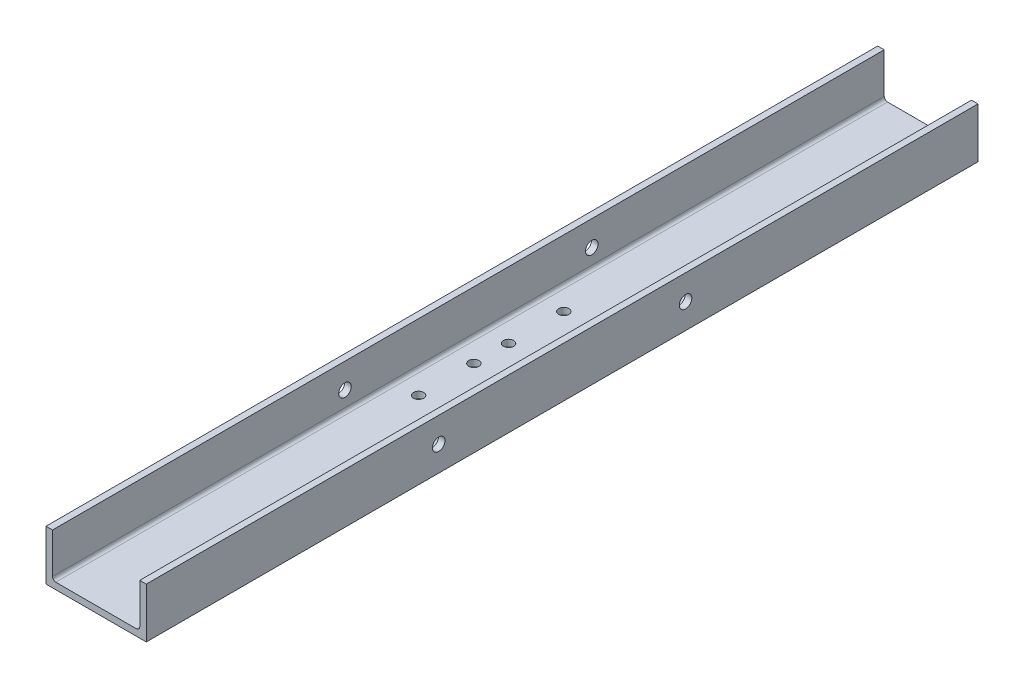
ISO-10303-21;
HEADER;
FILE_DESCRIPTION(('STEP AP214'),'2;1');
FILE_NAME('part.step','',(''),(''),'','','');
FILE_SCHEMA(('AUTOMOTIVE_DESIGN { 1 0 10303 214 1 1 1 1 }'));
ENDSEC;
DATA;
#1=APPLICATION_CONTEXT('core data for automotive mechanical design processes');
#2=APPLICATION_PROTOCOL_DEFINITION('international standard','automotive_design',2000,#1);
#3=PRODUCT_CONTEXT('',#1,'mechanical');
#4=PRODUCT('Part','Part','',(#3));
#5=PRODUCT_RELATED_PRODUCT_CATEGORY('part','',(#4));
#6=PRODUCT_DEFINITION_FORMATION('','',#4);
#7=PRODUCT_DEFINITION_CONTEXT('part definition',#1,'design');
#8=PRODUCT_DEFINITION('design','',#6,#7);
#9=PRODUCT_DEFINITION_SHAPE('','',#8);
#10=(LENGTH_UNIT() NAMED_UNIT(*) SI_UNIT(.MILLI.,.METRE.));
#11=(NAMED_UNIT(*) PLANE_ANGLE_UNIT() SI_UNIT($,.RADIAN.));
#12=(NAMED_UNIT(*) SI_UNIT($,.STERADIAN.) SOLID_ANGLE_UNIT());
#13=UNCERTAINTY_MEASURE_WITH_UNIT(LENGTH_MEASURE(1.E-05),#10,'distance_accuracy_value','');
#14=(GEOMETRIC_REPRESENTATION_CONTEXT(3) GLOBAL_UNCERTAINTY_ASSIGNED_CONTEXT((#13)) GLOBAL_UNIT_ASSIGNED_CONTEXT((#10,
#11,#12)) REPRESENTATION_CONTEXT('',''));
#15=CARTESIAN_POINT('',(0.,0.,0.));
#16=DIRECTION('',(0.,0.,1.));
#17=DIRECTION('',(1.,0.,0.));
#18=AXIS2_PLACEMENT_3D('',#15,#16,#17);
#19=CARTESIAN_POINT('',(-22.098,12.7,210.695));
#20=DIRECTION('',(0.,-1.,0.));
#21=DIRECTION('',(1.,0.,0.));
#22=AXIS2_PLACEMENT_3D('',#19,#20,#21);
#23=PLANE('',#22);
#24=DIRECTION('',(-1.,0.,0.));
#25=VECTOR('',#24,1.);
#26=CARTESIAN_POINT('',(-22.098,12.7,-210.695));
#27=LINE('',#26,#25);
#28=CARTESIAN_POINT('',(-22.098,12.7,-210.695));
#29=VERTEX_POINT('',#28);
#30=CARTESIAN_POINT('',(-25.4,12.7,-210.695));
#31=VERTEX_POINT('',#30);
#32=EDGE_CURVE('E138',#29,#31,#27,.T.);
#33=ORIENTED_EDGE('',*,*,#32,.T.);
#34=DIRECTION('',(0.,0.,-1.));
#35=VECTOR('',#34,1.);
#36=CARTESIAN_POINT('',(-25.4,12.7,210.695));
#37=LINE('',#36,#35);
#38=CARTESIAN_POINT('',(-25.4,12.7,210.695));
#39=VERTEX_POINT('',#38);
#40=EDGE_CURVE('E121',#39,#31,#37,.T.);
#41=ORIENTED_EDGE('',*,*,#40,.F.);
#42=DIRECTION('',(-1.,0.,0.));
#43=VECTOR('',#42,1.);
#44=CARTESIAN_POINT('',(-22.098,12.7,210.695));
#45=LINE('',#44,#43);
#46=CARTESIAN_POINT('',(-22.098,12.7,210.695));
#47=VERTEX_POINT('',#46);
#48=EDGE_CURVE('E127',#47,#39,#45,.T.);
#49=ORIENTED_EDGE('',*,*,#48,.F.);
#50=DIRECTION('',(0.,0.,-1.));
#51=VECTOR('',#50,1.);
#52=CARTESIAN_POINT('',(-22.098,12.7,210.695));
#53=LINE('',#52,#51);
#54=EDGE_CURVE('E241',#47,#29,#53,.T.);
#55=ORIENTED_EDGE('',*,*,#54,.T.);
#56=EDGE_LOOP('',(#33,#41,#49,#55));
#57=FACE_BOUND('',#56,.T.);
#58=ADVANCED_FACE('F39',(#57),#23,.F.);
#59=CARTESIAN_POINT('',(-25.4,12.7,210.695));
#60=DIRECTION('',(1.,0.,0.));
#61=DIRECTION('',(0.,1.,0.));
#62=AXIS2_PLACEMENT_3D('',#59,#60,#61);
#63=PLANE('',#62);
#64=CARTESIAN_POINT('',(-25.4,0.,62.52));
#65=DIRECTION('',(1.,0.,0.));
#66=DIRECTION('',(0.,1.,0.));
#67=AXIS2_PLACEMENT_3D('',#64,#65,#66);
#68=CIRCLE('',#67,3.18);
#69=CARTESIAN_POINT('',(-25.4,3.18,62.52));
#70=VERTEX_POINT('',#69);
#71=EDGE_CURVE('E179',#70,#70,#68,.T.);
#72=ORIENTED_EDGE('',*,*,#71,.T.);
#73=EDGE_LOOP('',(#72));
#74=FACE_BOUND('',#73,.T.);
#75=CARTESIAN_POINT('',(-25.4,0.,-62.52));
#76=DIRECTION('',(1.,0.,0.));
#77=DIRECTION('',(0.,1.,0.));
#78=AXIS2_PLACEMENT_3D('',#75,#76,#77);
#79=CIRCLE('',#78,3.18);
#80=CARTESIAN_POINT('',(-25.4,3.18000000000001,-62.52));
#81=VERTEX_POINT('',#80);
#82=EDGE_CURVE('E168',#81,#81,#79,.T.);
#83=ORIENTED_EDGE('',*,*,#82,.T.);
#84=EDGE_LOOP('',(#83));
#85=FACE_BOUND('',#84,.T.);
#86=DIRECTION('',(0.,-1.,0.));
#87=VECTOR('',#86,1.);
#88=CARTESIAN_POINT('',(-25.4,12.7,-210.695));
#89=LINE('',#88,#87);
#90=CARTESIAN_POINT('',(-25.4,-12.7,-210.695));
#91=VERTEX_POINT('',#90);
#92=EDGE_CURVE('E243',#31,#91,#89,.T.);
#93=ORIENTED_EDGE('',*,*,#92,.T.);
#94=DIRECTION('',(0.,0.,-1.));
#95=VECTOR('',#94,1.);
#96=CARTESIAN_POINT('',(-25.4,-12.7,210.695));
#97=LINE('',#96,#95);
#98=CARTESIAN_POINT('',(-25.4,-12.7,210.695));
#99=VERTEX_POINT('',#98);
#100=EDGE_CURVE('E124',#99,#91,#97,.T.);
#101=ORIENTED_EDGE('',*,*,#100,.F.);
#102=DIRECTION('',(0.,-1.,0.));
#103=VECTOR('',#102,1.);
#104=CARTESIAN_POINT('',(-25.4,12.7,210.695));
#105=LINE('',#104,#103);
#106=EDGE_CURVE('E117',#39,#99,#105,.T.);
#107=ORIENTED_EDGE('',*,*,#106,.F.);
#108=ORIENTED_EDGE('',*,*,#40,.T.);
#109=EDGE_LOOP('',(#93,#101,#107,#108));
#110=FACE_BOUND('',#109,.T.);
#111=ADVANCED_FACE('F119',(#74,#85,#110),#63,.F.);
#112=CARTESIAN_POINT('',(-25.4,-12.7,210.695));
#113=DIRECTION('',(0.,1.,0.));
#114=DIRECTION('',(-1.,0.,0.));
#115=AXIS2_PLACEMENT_3D('',#112,#113,#114);
#116=PLANE('',#115);
#117=CARTESIAN_POINT('',(-10.5304351416879,-12.7,36.79));
#118=DIRECTION('',(0.,1.,0.));
#119=DIRECTION('',(-1.,0.,0.));
#120=AXIS2_PLACEMENT_3D('',#117,#118,#119);
#121=CIRCLE('',#120,2.58499999999999);
#122=CARTESIAN_POINT('',(-13.1154351416879,-12.7,36.79));
#123=VERTEX_POINT('',#122);
#124=EDGE_CURVE('E227',#123,#123,#121,.T.);
#125=ORIENTED_EDGE('',*,*,#124,.T.);
#126=EDGE_LOOP('',(#125));
#127=FACE_BOUND('',#126,.T.);
#128=CARTESIAN_POINT('',(10.4695648583121,-12.7,-36.79));
#129=DIRECTION('',(0.,1.,0.));
#130=DIRECTION('',(-1.,0.,0.));
#131=AXIS2_PLACEMENT_3D('',#128,#129,#130);
#132=CIRCLE('',#131,2.58499999999999);
#133=CARTESIAN_POINT('',(7.88456485831209,-12.7,-36.79));
#134=VERTEX_POINT('',#133);
#135=EDGE_CURVE('E224',#134,#134,#132,.T.);
#136=ORIENTED_EDGE('',*,*,#135,.T.);
#137=EDGE_LOOP('',(#136));
#138=FACE_BOUND('',#137,.T.);
#139=CARTESIAN_POINT('',(-10.5304351416879,-12.7,-36.79));
#140=DIRECTION('',(0.,1.,0.));
#141=DIRECTION('',(-1.,0.,0.));
#142=AXIS2_PLACEMENT_3D('',#139,#140,#141);
#143=CIRCLE('',#142,2.58499999999999);
#144=CARTESIAN_POINT('',(-13.1154351416879,-12.7,-36.79));
#145=VERTEX_POINT('',#144);
#146=EDGE_CURVE('E221',#145,#145,#143,.T.);
#147=ORIENTED_EDGE('',*,*,#146,.T.);
#148=EDGE_LOOP('',(#147));
#149=FACE_BOUND('',#148,.T.);
#150=CARTESIAN_POINT('',(10.4695648583121,-12.7,-8.78999999999999));
#151=DIRECTION('',(0.,1.,0.));
#152=DIRECTION('',(-1.,0.,0.));
#153=AXIS2_PLACEMENT_3D('',#150,#151,#152);
#154=CIRCLE('',#153,2.58499999999999);
#155=CARTESIAN_POINT('',(7.88456485831208,-12.7,-8.78999999999999));
#156=VERTEX_POINT('',#155);
#157=EDGE_CURVE('E218',#156,#156,#154,.T.);
#158=ORIENTED_EDGE('',*,*,#157,.T.);
#159=EDGE_LOOP('',(#158));
#160=FACE_BOUND('',#159,.T.);
#161=CARTESIAN_POINT('',(10.4695648583121,-12.7,36.79));
#162=DIRECTION('',(0.,1.,0.));
#163=DIRECTION('',(-1.,0.,0.));
#164=AXIS2_PLACEMENT_3D('',#161,#162,#163);
#165=CIRCLE('',#164,2.58499999999999);
#166=CARTESIAN_POINT('',(7.88456485831209,-12.7,36.79));
#167=VERTEX_POINT('',#166);
#168=EDGE_CURVE('E215',#167,#167,#165,.T.);
#169=ORIENTED_EDGE('',*,*,#168,.T.);
#170=EDGE_LOOP('',(#169));
#171=FACE_BOUND('',#170,.T.);
#172=CARTESIAN_POINT('',(10.4695648583121,-12.7,8.78999999999999));
#173=DIRECTION('',(0.,1.,0.));
#174=DIRECTION('',(-1.,0.,0.));
#175=AXIS2_PLACEMENT_3D('',#172,#173,#174);
#176=CIRCLE('',#175,2.58499999999999);
#177=CARTESIAN_POINT('',(7.88456485831208,-12.7,8.78999999999999));
#178=VERTEX_POINT('',#177);
#179=EDGE_CURVE('E212',#178,#178,#176,.T.);
#180=ORIENTED_EDGE('',*,*,#179,.T.);
#181=EDGE_LOOP('',(#180));
#182=FACE_BOUND('',#181,.T.);
#183=CARTESIAN_POINT('',(-10.5304351416879,-12.7,8.79));
#184=DIRECTION('',(0.,1.,0.));
#185=DIRECTION('',(-1.,0.,0.));
#186=AXIS2_PLACEMENT_3D('',#183,#184,#185);
#187=CIRCLE('',#186,2.58499999999998);
#188=CARTESIAN_POINT('',(-13.1154351416879,-12.7,8.79));
#189=VERTEX_POINT('',#188);
#190=EDGE_CURVE('E209',#189,#189,#187,.T.);
#191=ORIENTED_EDGE('',*,*,#190,.T.);
#192=EDGE_LOOP('',(#191));
#193=FACE_BOUND('',#192,.T.);
#194=CARTESIAN_POINT('',(-10.5304351416879,-12.7,-8.79));
#195=DIRECTION('',(0.,1.,0.));
#196=DIRECTION('',(-1.,0.,0.));
#197=AXIS2_PLACEMENT_3D('',#194,#195,#196);
#198=CIRCLE('',#197,2.58499999999998);
#199=CARTESIAN_POINT('',(-13.1154351416879,-12.7,-8.79));
#200=VERTEX_POINT('',#199);
#201=EDGE_CURVE('E206',#200,#200,#198,.T.);
#202=ORIENTED_EDGE('',*,*,#201,.T.);
#203=EDGE_LOOP('',(#202));
#204=FACE_BOUND('',#203,.T.);
#205=DIRECTION('',(1.,0.,0.));
#206=VECTOR('',#205,1.);
#207=CARTESIAN_POINT('',(-25.4,-12.7,-210.695));
#208=LINE('',#207,#206);
#209=CARTESIAN_POINT('',(25.4,-12.7,-210.695));
#210=VERTEX_POINT('',#209);
#211=EDGE_CURVE('E245',#91,#210,#208,.T.);
#212=ORIENTED_EDGE('',*,*,#211,.T.);
#213=DIRECTION('',(0.,0.,-1.));
#214=VECTOR('',#213,1.);
#215=CARTESIAN_POINT('',(25.4,-12.7,210.695));
#216=LINE('',#215,#214);
#217=CARTESIAN_POINT('',(25.4,-12.7,210.695));
#218=VERTEX_POINT('',#217);
#219=EDGE_CURVE('E143',#218,#210,#216,.T.);
#220=ORIENTED_EDGE('',*,*,#219,.F.);
#221=DIRECTION('',(1.,0.,0.));
#222=VECTOR('',#221,1.);
#223=CARTESIAN_POINT('',(-25.4,-12.7,210.695));
#224=LINE('',#223,#222);
#225=EDGE_CURVE('E126',#99,#218,#224,.T.);
#226=ORIENTED_EDGE('',*,*,#225,.F.);
#227=ORIENTED_EDGE('',*,*,#100,.T.);
#228=EDGE_LOOP('',(#212,#220,#226,#227));
#229=FACE_BOUND('',#228,.T.);
#230=ADVANCED_FACE('F312',(#127,#138,#149,#160,#171,#182,#193,#204,#229),#116,.F.);
#231=CARTESIAN_POINT('',(25.4,-12.7,210.695));
#232=DIRECTION('',(-1.,0.,0.));
#233=DIRECTION('',(0.,-1.,0.));
#234=AXIS2_PLACEMENT_3D('',#231,#232,#233);
#235=PLANE('',#234);
#236=CARTESIAN_POINT('',(25.4,0.,62.52));
#237=DIRECTION('',(-1.,0.,0.));
#238=DIRECTION('',(0.,-1.,0.));
#239=AXIS2_PLACEMENT_3D('',#236,#237,#238);
#240=CIRCLE('',#239,3.18);
#241=CARTESIAN_POINT('',(25.4,-3.18000000000001,62.52));
#242=VERTEX_POINT('',#241);
#243=EDGE_CURVE('E176',#242,#242,#240,.T.);
#244=ORIENTED_EDGE('',*,*,#243,.T.);
#245=EDGE_LOOP('',(#244));
#246=FACE_BOUND('',#245,.T.);
#247=CARTESIAN_POINT('',(25.4,0.,-62.52));
#248=DIRECTION('',(-1.,0.,0.));
#249=DIRECTION('',(0.,-1.,0.));
#250=AXIS2_PLACEMENT_3D('',#247,#248,#249);
#251=CIRCLE('',#250,3.18);
#252=CARTESIAN_POINT('',(25.4,-3.18,-62.52));
#253=VERTEX_POINT('',#252);
#254=EDGE_CURVE('E163',#253,#253,#251,.T.);
#255=ORIENTED_EDGE('',*,*,#254,.T.);
#256=EDGE_LOOP('',(#255));
#257=FACE_BOUND('',#256,.T.);
#258=DIRECTION('',(0.,1.,0.));
#259=VECTOR('',#258,1.);
#260=CARTESIAN_POINT('',(25.4,-12.7,-210.695));
#261=LINE('',#260,#259);
#262=CARTESIAN_POINT('',(25.4,12.7,-210.695));
#263=VERTEX_POINT('',#262);
#264=EDGE_CURVE('E247',#210,#263,#261,.T.);
#265=ORIENTED_EDGE('',*,*,#264,.T.);
#266=DIRECTION('',(0.,0.,-1.));
#267=VECTOR('',#266,1.);
#268=CARTESIAN_POINT('',(25.4,12.7,210.695));
#269=LINE('',#268,#267);
#270=CARTESIAN_POINT('',(25.4,12.7,210.695));
#271=VERTEX_POINT('',#270);
#272=EDGE_CURVE('E262',#271,#263,#269,.T.);
#273=ORIENTED_EDGE('',*,*,#272,.F.);
#274=DIRECTION('',(0.,1.,0.));
#275=VECTOR('',#274,1.);
#276=CARTESIAN_POINT('',(25.4,-12.7,210.695));
#277=LINE('',#276,#275);
#278=EDGE_CURVE('E231',#218,#271,#277,.T.);
#279=ORIENTED_EDGE('',*,*,#278,.F.);
#280=ORIENTED_EDGE('',*,*,#219,.T.);
#281=EDGE_LOOP('',(#265,#273,#279,#280));
#282=FACE_BOUND('',#281,.T.);
#283=ADVANCED_FACE('F269',(#246,#257,#282),#235,.F.);
#284=CARTESIAN_POINT('',(25.4,12.7,210.695));
#285=DIRECTION('',(0.,-1.,0.));
#286=DIRECTION('',(1.,0.,0.));
#287=AXIS2_PLACEMENT_3D('',#284,#285,#286);
#288=PLANE('',#287);
#289=DIRECTION('',(-1.,0.,0.));
#290=VECTOR('',#289,1.);
#291=CARTESIAN_POINT('',(25.4,12.7,-210.695));
#292=LINE('',#291,#290);
#293=CARTESIAN_POINT('',(22.098,12.7,-210.695));
#294=VERTEX_POINT('',#293);
#295=EDGE_CURVE('E249',#263,#294,#292,.T.);
#296=ORIENTED_EDGE('',*,*,#295,.T.);
#297=DIRECTION('',(0.,0.,-1.));
#298=VECTOR('',#297,1.);
#299=CARTESIAN_POINT('',(22.098,12.7,210.695));
#300=LINE('',#299,#298);
#301=CARTESIAN_POINT('',(22.098,12.7,210.695));
#302=VERTEX_POINT('',#301);
#303=EDGE_CURVE('E259',#302,#294,#300,.T.);
#304=ORIENTED_EDGE('',*,*,#303,.F.);
#305=DIRECTION('',(-1.,0.,0.));
#306=VECTOR('',#305,1.);
#307=CARTESIAN_POINT('',(25.4,12.7,210.695));
#308=LINE('',#307,#306);
#309=EDGE_CURVE('E233',#271,#302,#308,.T.);
#310=ORIENTED_EDGE('',*,*,#309,.F.);
#311=ORIENTED_EDGE('',*,*,#272,.T.);
#312=EDGE_LOOP('',(#296,#304,#310,#311));
#313=FACE_BOUND('',#312,.T.);
#314=ADVANCED_FACE('F279',(#313),#288,.F.);
#315=CARTESIAN_POINT('',(22.098,12.7,210.695));
#316=DIRECTION('',(1.,0.,0.));
#317=DIRECTION('',(0.,1.,0.));
#318=AXIS2_PLACEMENT_3D('',#315,#316,#317);
#319=PLANE('',#318);
#320=CARTESIAN_POINT('',(22.098,0.,62.52));
#321=DIRECTION('',(1.,0.,0.));
#322=DIRECTION('',(0.,1.,0.));
#323=AXIS2_PLACEMENT_3D('',#320,#321,#322);
#324=CIRCLE('',#323,3.18);
#325=CARTESIAN_POINT('',(22.098,3.18,62.52));
#326=VERTEX_POINT('',#325);
#327=EDGE_CURVE('E173',#326,#326,#324,.T.);
#328=ORIENTED_EDGE('',*,*,#327,.T.);
#329=EDGE_LOOP('',(#328));
#330=FACE_BOUND('',#329,.T.);
#331=CARTESIAN_POINT('',(22.098,0.,-62.52));
#332=DIRECTION('',(1.,0.,0.));
#333=DIRECTION('',(0.,1.,0.));
#334=AXIS2_PLACEMENT_3D('',#331,#332,#333);
#335=CIRCLE('',#334,3.18);
#336=CARTESIAN_POINT('',(22.098,3.18000000000001,-62.52));
#337=VERTEX_POINT('',#336);
#338=EDGE_CURVE('E159',#337,#337,#335,.T.);
#339=ORIENTED_EDGE('',*,*,#338,.T.);
#340=EDGE_LOOP('',(#339));
#341=FACE_BOUND('',#340,.T.);
#342=DIRECTION('',(0.,-1.,0.));
#343=VECTOR('',#342,1.);
#344=CARTESIAN_POINT('',(22.098,12.7,-210.695));
#345=LINE('',#344,#343);
#346=CARTESIAN_POINT('',(22.098,-7.747,-210.695));
#347=VERTEX_POINT('',#346);
#348=EDGE_CURVE('E251',#294,#347,#345,.T.);
#349=ORIENTED_EDGE('',*,*,#348,.T.);
#350=DIRECTION('',(0.,0.,-1.));
#351=VECTOR('',#350,1.);
#352=CARTESIAN_POINT('',(22.098,-7.747,210.695));
#353=LINE('',#352,#351);
#354=CARTESIAN_POINT('',(22.098,-7.747,210.695));
#355=VERTEX_POINT('',#354);
#356=EDGE_CURVE('E149',#347,#355,#353,.F.);
#357=ORIENTED_EDGE('',*,*,#356,.T.);
#358=DIRECTION('',(0.,-1.,0.));
#359=VECTOR('',#358,1.);
#360=CARTESIAN_POINT('',(22.098,12.7,210.695));
#361=LINE('',#360,#359);
#362=EDGE_CURVE('E235',#302,#355,#361,.T.);
#363=ORIENTED_EDGE('',*,*,#362,.F.);
#364=ORIENTED_EDGE('',*,*,#303,.T.);
#365=EDGE_LOOP('',(#349,#357,#363,#364));
#366=FACE_BOUND('',#365,.T.);
#367=ADVANCED_FACE('F283',(#330,#341,#366),#319,.F.);
#368=CARTESIAN_POINT('',(22.098,-9.398,210.695));
#369=DIRECTION('',(0.,-1.,0.));
#370=DIRECTION('',(1.,0.,0.));
#371=AXIS2_PLACEMENT_3D('',#368,#369,#370);
#372=PLANE('',#371);
#373=CARTESIAN_POINT('',(-10.5304351416879,-9.39800000000001,36.79));
#374=DIRECTION('',(0.,1.,0.));
#375=DIRECTION('',(1.,0.,0.));
#376=AXIS2_PLACEMENT_3D('',#373,#374,#375);
#377=CIRCLE('',#376,2.58499999999999);
#378=CARTESIAN_POINT('',(-7.94543514168796,-9.39800000000001,36.79));
#379=VERTEX_POINT('',#378);
#380=EDGE_CURVE('E186',#379,#379,#377,.T.);
#381=ORIENTED_EDGE('',*,*,#380,.F.);
#382=EDGE_LOOP('',(#381));
#383=FACE_BOUND('',#382,.T.);
#384=CARTESIAN_POINT('',(10.4695648583121,-9.398,-36.79));
#385=DIRECTION('',(0.,1.,0.));
#386=DIRECTION('',(1.,0.,0.));
#387=AXIS2_PLACEMENT_3D('',#384,#385,#386);
#388=CIRCLE('',#387,2.58499999999999);
#389=CARTESIAN_POINT('',(13.0545648583121,-9.398,-36.79));
#390=VERTEX_POINT('',#389);
#391=EDGE_CURVE('E192',#390,#390,#388,.T.);
#392=ORIENTED_EDGE('',*,*,#391,.F.);
#393=EDGE_LOOP('',(#392));
#394=FACE_BOUND('',#393,.T.);
#395=CARTESIAN_POINT('',(-10.5304351416879,-9.39800000000001,-36.79));
#396=DIRECTION('',(0.,1.,0.));
#397=DIRECTION('',(-1.,0.,0.));
#398=AXIS2_PLACEMENT_3D('',#395,#396,#397);
#399=CIRCLE('',#398,2.58499999999999);
#400=CARTESIAN_POINT('',(-13.1154351416879,-9.39800000000001,-36.79));
#401=VERTEX_POINT('',#400);
#402=EDGE_CURVE('E195',#401,#401,#399,.T.);
#403=ORIENTED_EDGE('',*,*,#402,.F.);
#404=EDGE_LOOP('',(#403));
#405=FACE_BOUND('',#404,.T.);
#406=CARTESIAN_POINT('',(10.4695648583121,-9.398,-8.78999999999999));
#407=DIRECTION('',(0.,1.,0.));
#408=DIRECTION('',(1.,0.,0.));
#409=AXIS2_PLACEMENT_3D('',#406,#407,#408);
#410=CIRCLE('',#409,2.58499999999999);
#411=CARTESIAN_POINT('',(13.0545648583121,-9.398,-8.78999999999999));
#412=VERTEX_POINT('',#411);
#413=EDGE_CURVE('E198',#412,#412,#410,.T.);
#414=ORIENTED_EDGE('',*,*,#413,.F.);
#415=EDGE_LOOP('',(#414));
#416=FACE_BOUND('',#415,.T.);
#417=CARTESIAN_POINT('',(10.4695648583121,-9.398,36.79));
#418=DIRECTION('',(0.,1.,0.));
#419=DIRECTION('',(-1.,0.,0.));
#420=AXIS2_PLACEMENT_3D('',#417,#418,#419);
#421=CIRCLE('',#420,2.58499999999999);
#422=CARTESIAN_POINT('',(7.88456485831209,-9.398,36.79));
#423=VERTEX_POINT('',#422);
#424=EDGE_CURVE('E183',#423,#423,#421,.T.);
#425=ORIENTED_EDGE('',*,*,#424,.F.);
#426=EDGE_LOOP('',(#425));
#427=FACE_BOUND('',#426,.T.);
#428=CARTESIAN_POINT('',(10.4695648583121,-9.398,8.78999999999999));
#429=DIRECTION('',(0.,1.,0.));
#430=DIRECTION('',(-1.,0.,0.));
#431=AXIS2_PLACEMENT_3D('',#428,#429,#430);
#432=CIRCLE('',#431,2.58499999999999);
#433=CARTESIAN_POINT('',(7.88456485831208,-9.398,8.78999999999999));
#434=VERTEX_POINT('',#433);
#435=EDGE_CURVE('E187',#434,#434,#432,.T.);
#436=ORIENTED_EDGE('',*,*,#435,.F.);
#437=EDGE_LOOP('',(#436));
#438=FACE_BOUND('',#437,.T.);
#439=CARTESIAN_POINT('',(-10.5304351416879,-9.39800000000001,8.79));
#440=DIRECTION('',(0.,1.,0.));
#441=DIRECTION('',(1.,0.,0.));
#442=AXIS2_PLACEMENT_3D('',#439,#440,#441);
#443=CIRCLE('',#442,2.58499999999998);
#444=CARTESIAN_POINT('',(-7.94543514168796,-9.39800000000001,8.79));
#445=VERTEX_POINT('',#444);
#446=EDGE_CURVE('E182',#445,#445,#443,.T.);
#447=ORIENTED_EDGE('',*,*,#446,.F.);
#448=EDGE_LOOP('',(#447));
#449=FACE_BOUND('',#448,.T.);
#450=CARTESIAN_POINT('',(-10.5304351416879,-9.39800000000001,-8.79));
#451=DIRECTION('',(0.,1.,0.));
#452=DIRECTION('',(-1.,0.,0.));
#453=AXIS2_PLACEMENT_3D('',#450,#451,#452);
#454=CIRCLE('',#453,2.58499999999998);
#455=CARTESIAN_POINT('',(-13.1154351416879,-9.39800000000001,-8.79));
#456=VERTEX_POINT('',#455);
#457=EDGE_CURVE('E201',#456,#456,#454,.T.);
#458=ORIENTED_EDGE('',*,*,#457,.F.);
#459=EDGE_LOOP('',(#458));
#460=FACE_BOUND('',#459,.T.);
#461=DIRECTION('',(-1.,0.,0.));
#462=VECTOR('',#461,1.);
#463=CARTESIAN_POINT('',(22.098,-9.398,210.695));
#464=LINE('',#463,#462);
#465=CARTESIAN_POINT('',(20.447,-9.398,210.695));
#466=VERTEX_POINT('',#465);
#467=CARTESIAN_POINT('',(-20.447,-9.39800000000001,210.695));
#468=VERTEX_POINT('',#467);
#469=EDGE_CURVE('E238',#466,#468,#464,.T.);
#470=ORIENTED_EDGE('',*,*,#469,.F.);
#471=DIRECTION('',(0.,0.,-1.));
#472=VECTOR('',#471,1.);
#473=CARTESIAN_POINT('',(20.447,-9.398,-210.695));
#474=LINE('',#473,#472);
#475=CARTESIAN_POINT('',(20.447,-9.398,-210.695));
#476=VERTEX_POINT('',#475);
#477=EDGE_CURVE('E141',#466,#476,#474,.T.);
#478=ORIENTED_EDGE('',*,*,#477,.T.);
#479=DIRECTION('',(-1.,0.,0.));
#480=VECTOR('',#479,1.);
#481=CARTESIAN_POINT('',(22.098,-9.398,-210.695));
#482=LINE('',#481,#480);
#483=CARTESIAN_POINT('',(-20.447,-9.39800000000001,-210.695));
#484=VERTEX_POINT('',#483);
#485=EDGE_CURVE('E254',#476,#484,#482,.T.);
#486=ORIENTED_EDGE('',*,*,#485,.T.);
#487=DIRECTION('',(0.,0.,-1.));
#488=VECTOR('',#487,1.);
#489=CARTESIAN_POINT('',(-20.447,-9.39800000000001,210.695));
#490=LINE('',#489,#488);
#491=EDGE_CURVE('E139',#484,#468,#490,.F.);
#492=ORIENTED_EDGE('',*,*,#491,.T.);
#493=EDGE_LOOP('',(#470,#478,#486,#492));
#494=FACE_BOUND('',#493,.T.);
#495=ADVANCED_FACE('F292',(#383,#394,#405,#416,#427,#438,#449,#460,#494),#372,.F.);
#496=CARTESIAN_POINT('',(-22.098,-9.39800000000001,210.695));
#497=DIRECTION('',(-1.,0.,0.));
#498=DIRECTION('',(0.,-1.,0.));
#499=AXIS2_PLACEMENT_3D('',#496,#497,#498);
#500=PLANE('',#499);
#501=CARTESIAN_POINT('',(-22.098,0.,62.52));
#502=DIRECTION('',(-1.,0.,0.));
#503=DIRECTION('',(0.,-1.,0.));
#504=AXIS2_PLACEMENT_3D('',#501,#502,#503);
#505=CIRCLE('',#504,3.18);
#506=CARTESIAN_POINT('',(-22.098,-3.18000000000001,62.52));
#507=VERTEX_POINT('',#506);
#508=EDGE_CURVE('E43',#507,#507,#505,.T.);
#509=ORIENTED_EDGE('',*,*,#508,.T.);
#510=EDGE_LOOP('',(#509));
#511=FACE_BOUND('',#510,.T.);
#512=CARTESIAN_POINT('',(-22.098,0.,-62.52));
#513=DIRECTION('',(-1.,0.,0.));
#514=DIRECTION('',(0.,-1.,0.));
#515=AXIS2_PLACEMENT_3D('',#512,#513,#514);
#516=CIRCLE('',#515,3.18);
#517=CARTESIAN_POINT('',(-22.098,-3.18,-62.52));
#518=VERTEX_POINT('',#517);
#519=EDGE_CURVE('E157',#518,#518,#516,.T.);
#520=ORIENTED_EDGE('',*,*,#519,.T.);
#521=EDGE_LOOP('',(#520));
#522=FACE_BOUND('',#521,.T.);
#523=DIRECTION('',(0.,1.,0.));
#524=VECTOR('',#523,1.);
#525=CARTESIAN_POINT('',(-22.098,-9.39800000000001,210.695));
#526=LINE('',#525,#524);
#527=CARTESIAN_POINT('',(-22.098,-7.74700000000001,210.695));
#528=VERTEX_POINT('',#527);
#529=EDGE_CURVE('E131',#528,#47,#526,.T.);
#530=ORIENTED_EDGE('',*,*,#529,.F.);
#531=DIRECTION('',(0.,0.,-1.));
#532=VECTOR('',#531,1.);
#533=CARTESIAN_POINT('',(-22.098,-7.74700000000001,-210.695));
#534=LINE('',#533,#532);
#535=CARTESIAN_POINT('',(-22.098,-7.74700000000001,-210.695));
#536=VERTEX_POINT('',#535);
#537=EDGE_CURVE('E151',#528,#536,#534,.T.);
#538=ORIENTED_EDGE('',*,*,#537,.T.);
#539=DIRECTION('',(0.,1.,0.));
#540=VECTOR('',#539,1.);
#541=CARTESIAN_POINT('',(-22.098,-9.39800000000001,-210.695));
#542=LINE('',#541,#540);
#543=EDGE_CURVE('E135',#536,#29,#542,.T.);
#544=ORIENTED_EDGE('',*,*,#543,.T.);
#545=ORIENTED_EDGE('',*,*,#54,.F.);
#546=EDGE_LOOP('',(#530,#538,#544,#545));
#547=FACE_BOUND('',#546,.T.);
#548=ADVANCED_FACE('F295',(#511,#522,#547),#500,.F.);
#549=CARTESIAN_POINT('',(0.,0.,210.695));
#550=DIRECTION('',(0.,0.,1.));
#551=DIRECTION('',(1.,0.,0.));
#552=AXIS2_PLACEMENT_3D('',#549,#550,#551);
#553=PLANE('',#552);
#554=ORIENTED_EDGE('',*,*,#48,.T.);
#555=ORIENTED_EDGE('',*,*,#106,.T.);
#556=ORIENTED_EDGE('',*,*,#225,.T.);
#557=ORIENTED_EDGE('',*,*,#278,.T.);
#558=ORIENTED_EDGE('',*,*,#309,.T.);
#559=ORIENTED_EDGE('',*,*,#362,.T.);
#560=CARTESIAN_POINT('',(20.447,-7.747,210.695));
#561=DIRECTION('',(0.,0.,1.));
#562=DIRECTION('',(1.,0.,0.));
#563=AXIS2_PLACEMENT_3D('',#560,#561,#562);
#564=CIRCLE('',#563,1.651);
#565=EDGE_CURVE('E155',#355,#466,#564,.F.);
#566=ORIENTED_EDGE('',*,*,#565,.T.);
#567=ORIENTED_EDGE('',*,*,#469,.T.);
#568=CARTESIAN_POINT('',(-20.447,-7.74700000000001,210.695));
#569=DIRECTION('',(0.,0.,1.));
#570=DIRECTION('',(1.,0.,0.));
#571=AXIS2_PLACEMENT_3D('',#568,#569,#570);
#572=CIRCLE('',#571,1.651);
#573=EDGE_CURVE('E11',#468,#528,#572,.F.);
#574=ORIENTED_EDGE('',*,*,#573,.T.);
#575=ORIENTED_EDGE('',*,*,#529,.T.);
#576=EDGE_LOOP('',(#554,#555,#556,#557,#558,#559,#566,#567,#574,#575));
#577=FACE_BOUND('',#576,.T.);
#578=ADVANCED_FACE('F130',(#577),#553,.T.);
#579=CARTESIAN_POINT('',(0.,0.,-210.695));
#580=DIRECTION('',(0.,0.,1.));
#581=DIRECTION('',(1.,0.,0.));
#582=AXIS2_PLACEMENT_3D('',#579,#580,#581);
#583=PLANE('',#582);
#584=ORIENTED_EDGE('',*,*,#32,.F.);
#585=ORIENTED_EDGE('',*,*,#543,.F.);
#586=CARTESIAN_POINT('',(-20.447,-7.74700000000001,-210.695));
#587=DIRECTION('',(0.,0.,1.));
#588=DIRECTION('',(1.,0.,0.));
#589=AXIS2_PLACEMENT_3D('',#586,#587,#588);
#590=CIRCLE('',#589,1.651);
#591=EDGE_CURVE('E48',#536,#484,#590,.T.);
#592=ORIENTED_EDGE('',*,*,#591,.T.);
#593=ORIENTED_EDGE('',*,*,#485,.F.);
#594=CARTESIAN_POINT('',(20.447,-7.747,-210.695));
#595=DIRECTION('',(0.,0.,1.));
#596=DIRECTION('',(1.,0.,0.));
#597=AXIS2_PLACEMENT_3D('',#594,#595,#596);
#598=CIRCLE('',#597,1.651);
#599=EDGE_CURVE('E153',#476,#347,#598,.T.);
#600=ORIENTED_EDGE('',*,*,#599,.T.);
#601=ORIENTED_EDGE('',*,*,#348,.F.);
#602=ORIENTED_EDGE('',*,*,#295,.F.);
#603=ORIENTED_EDGE('',*,*,#264,.F.);
#604=ORIENTED_EDGE('',*,*,#211,.F.);
#605=ORIENTED_EDGE('',*,*,#92,.F.);
#606=EDGE_LOOP('',(#584,#585,#592,#593,#600,#601,#602,#603,#604,#605));
#607=FACE_BOUND('',#606,.T.);
#608=ADVANCED_FACE('F275',(#607),#583,.F.);
#609=CARTESIAN_POINT('',(20.447,-7.747,210.695));
#610=DIRECTION('',(0.,0.,1.));
#611=DIRECTION('',(1.,0.,0.));
#612=AXIS2_PLACEMENT_3D('',#609,#610,#611);
#613=CYLINDRICAL_SURFACE('',#612,1.651);
#614=ORIENTED_EDGE('',*,*,#565,.F.);
#615=ORIENTED_EDGE('',*,*,#356,.F.);
#616=ORIENTED_EDGE('',*,*,#599,.F.);
#617=ORIENTED_EDGE('',*,*,#477,.F.);
#618=EDGE_LOOP('',(#614,#615,#616,#617));
#619=FACE_BOUND('',#618,.T.);
#620=ADVANCED_FACE('F289',(#619),#613,.F.);
#621=CARTESIAN_POINT('',(-20.447,-7.74700000000001,210.695));
#622=DIRECTION('',(0.,0.,1.));
#623=DIRECTION('',(1.,0.,0.));
#624=AXIS2_PLACEMENT_3D('',#621,#622,#623);
#625=CYLINDRICAL_SURFACE('',#624,1.651);
#626=ORIENTED_EDGE('',*,*,#573,.F.);
#627=ORIENTED_EDGE('',*,*,#491,.F.);
#628=ORIENTED_EDGE('',*,*,#591,.F.);
#629=ORIENTED_EDGE('',*,*,#537,.F.);
#630=EDGE_LOOP('',(#626,#627,#628,#629));
#631=FACE_BOUND('',#630,.T.);
#632=ADVANCED_FACE('F41',(#631),#625,.F.);
#633=CARTESIAN_POINT('',(-10.5304351416879,-19.398,-8.79));
#634=DIRECTION('',(0.,1.,0.));
#635=DIRECTION('',(-1.,0.,0.));
#636=AXIS2_PLACEMENT_3D('',#633,#634,#635);
#637=CYLINDRICAL_SURFACE('',#636,2.58499999999998);
#638=ORIENTED_EDGE('',*,*,#457,.T.);
#639=EDGE_LOOP('',(#638));
#640=FACE_BOUND('',#639,.T.);
#641=ORIENTED_EDGE('',*,*,#201,.F.);
#642=EDGE_LOOP('',(#641));
#643=FACE_BOUND('',#642,.T.);
#644=ADVANCED_FACE('F297',(#640,#643),#637,.F.);
#645=CARTESIAN_POINT('',(-10.5304351416879,-19.398,8.79));
#646=DIRECTION('',(0.,1.,0.));
#647=DIRECTION('',(-1.,0.,0.));
#648=AXIS2_PLACEMENT_3D('',#645,#646,#647);
#649=CYLINDRICAL_SURFACE('',#648,2.58499999999998);
#650=ORIENTED_EDGE('',*,*,#446,.T.);
#651=EDGE_LOOP('',(#650));
#652=FACE_BOUND('',#651,.T.);
#653=ORIENTED_EDGE('',*,*,#190,.F.);
#654=EDGE_LOOP('',(#653));
#655=FACE_BOUND('',#654,.T.);
#656=ADVANCED_FACE('F303',(#652,#655),#649,.F.);
#657=CARTESIAN_POINT('',(10.4695648583121,-19.398,8.78999999999999));
#658=DIRECTION('',(0.,1.,0.));
#659=DIRECTION('',(-1.,0.,0.));
#660=AXIS2_PLACEMENT_3D('',#657,#658,#659);
#661=CYLINDRICAL_SURFACE('',#660,2.58499999999999);
#662=ORIENTED_EDGE('',*,*,#435,.T.);
#663=EDGE_LOOP('',(#662));
#664=FACE_BOUND('',#663,.T.);
#665=ORIENTED_EDGE('',*,*,#179,.F.);
#666=EDGE_LOOP('',(#665));
#667=FACE_BOUND('',#666,.T.);
#668=ADVANCED_FACE('F355',(#664,#667),#661,.F.);
#669=CARTESIAN_POINT('',(10.4695648583121,-19.398,36.79));
#670=DIRECTION('',(0.,1.,0.));
#671=DIRECTION('',(-1.,0.,0.));
#672=AXIS2_PLACEMENT_3D('',#669,#670,#671);
#673=CYLINDRICAL_SURFACE('',#672,2.58499999999999);
#674=ORIENTED_EDGE('',*,*,#424,.T.);
#675=EDGE_LOOP('',(#674));
#676=FACE_BOUND('',#675,.T.);
#677=ORIENTED_EDGE('',*,*,#168,.F.);
#678=EDGE_LOOP('',(#677));
#679=FACE_BOUND('',#678,.T.);
#680=ADVANCED_FACE('F343',(#676,#679),#673,.F.);
#681=CARTESIAN_POINT('',(10.4695648583121,-19.398,-8.78999999999999));
#682=DIRECTION('',(0.,1.,0.));
#683=DIRECTION('',(-1.,0.,0.));
#684=AXIS2_PLACEMENT_3D('',#681,#682,#683);
#685=CYLINDRICAL_SURFACE('',#684,2.58499999999999);
#686=ORIENTED_EDGE('',*,*,#413,.T.);
#687=EDGE_LOOP('',(#686));
#688=FACE_BOUND('',#687,.T.);
#689=ORIENTED_EDGE('',*,*,#157,.F.);
#690=EDGE_LOOP('',(#689));
#691=FACE_BOUND('',#690,.T.);
#692=ADVANCED_FACE('F339',(#688,#691),#685,.F.);
#693=CARTESIAN_POINT('',(-10.5304351416879,-19.398,-36.79));
#694=DIRECTION('',(0.,1.,0.));
#695=DIRECTION('',(-1.,0.,0.));
#696=AXIS2_PLACEMENT_3D('',#693,#694,#695);
#697=CYLINDRICAL_SURFACE('',#696,2.58499999999999);
#698=ORIENTED_EDGE('',*,*,#402,.T.);
#699=EDGE_LOOP('',(#698));
#700=FACE_BOUND('',#699,.T.);
#701=ORIENTED_EDGE('',*,*,#146,.F.);
#702=EDGE_LOOP('',(#701));
#703=FACE_BOUND('',#702,.T.);
#704=ADVANCED_FACE('F335',(#700,#703),#697,.F.);
#705=CARTESIAN_POINT('',(10.4695648583121,-19.398,-36.79));
#706=DIRECTION('',(0.,1.,0.));
#707=DIRECTION('',(-1.,0.,0.));
#708=AXIS2_PLACEMENT_3D('',#705,#706,#707);
#709=CYLINDRICAL_SURFACE('',#708,2.58499999999999);
#710=ORIENTED_EDGE('',*,*,#391,.T.);
#711=EDGE_LOOP('',(#710));
#712=FACE_BOUND('',#711,.T.);
#713=ORIENTED_EDGE('',*,*,#135,.F.);
#714=EDGE_LOOP('',(#713));
#715=FACE_BOUND('',#714,.T.);
#716=ADVANCED_FACE('F338',(#712,#715),#709,.F.);
#717=CARTESIAN_POINT('',(-10.5304351416879,-19.398,36.79));
#718=DIRECTION('',(0.,1.,0.));
#719=DIRECTION('',(-1.,0.,0.));
#720=AXIS2_PLACEMENT_3D('',#717,#718,#719);
#721=CYLINDRICAL_SURFACE('',#720,2.58499999999999);
#722=ORIENTED_EDGE('',*,*,#380,.T.);
#723=EDGE_LOOP('',(#722));
#724=FACE_BOUND('',#723,.T.);
#725=ORIENTED_EDGE('',*,*,#124,.F.);
#726=EDGE_LOOP('',(#725));
#727=FACE_BOUND('',#726,.T.);
#728=ADVANCED_FACE('F345',(#724,#727),#721,.F.);
#729=CARTESIAN_POINT('',(-30.,0.,-62.52));
#730=DIRECTION('',(1.,0.,0.));
#731=DIRECTION('',(0.,0.,-1.));
#732=AXIS2_PLACEMENT_3D('',#729,#730,#731);
#733=CYLINDRICAL_SURFACE('',#732,3.18);
#734=ORIENTED_EDGE('',*,*,#519,.F.);
#735=EDGE_LOOP('',(#734));
#736=FACE_BOUND('',#735,.T.);
#737=ORIENTED_EDGE('',*,*,#82,.F.);
#738=EDGE_LOOP('',(#737));
#739=FACE_BOUND('',#738,.T.);
#740=ADVANCED_FACE('F348',(#736,#739),#733,.F.);
#741=CARTESIAN_POINT('',(-30.,0.,62.52));
#742=DIRECTION('',(1.,0.,0.));
#743=DIRECTION('',(0.,0.,-1.));
#744=AXIS2_PLACEMENT_3D('',#741,#742,#743);
#745=CYLINDRICAL_SURFACE('',#744,3.18);
#746=ORIENTED_EDGE('',*,*,#508,.F.);
#747=EDGE_LOOP('',(#746));
#748=FACE_BOUND('',#747,.T.);
#749=ORIENTED_EDGE('',*,*,#71,.F.);
#750=EDGE_LOOP('',(#749));
#751=FACE_BOUND('',#750,.T.);
#752=ADVANCED_FACE('F365',(#748,#751),#745,.F.);
#753=ORIENTED_EDGE('',*,*,#338,.F.);
#754=EDGE_LOOP('',(#753));
#755=FACE_BOUND('',#754,.T.);
#756=ORIENTED_EDGE('',*,*,#254,.F.);
#757=EDGE_LOOP('',(#756));
#758=FACE_BOUND('',#757,.T.);
#759=ADVANCED_FACE('F367',(#755,#758),#733,.F.);
#760=ORIENTED_EDGE('',*,*,#327,.F.);
#761=EDGE_LOOP('',(#760));
#762=FACE_BOUND('',#761,.T.);
#763=ORIENTED_EDGE('',*,*,#243,.F.);
#764=EDGE_LOOP('',(#763));
#765=FACE_BOUND('',#764,.T.);
#766=ADVANCED_FACE('F370',(#762,#765),#745,.F.);
#767=CLOSED_SHELL('',(#58,#111,#230,#283,#314,#367,#495,#548,#578,#608,#620,#632,#644,#656,#668,
#680,#692,#704,#716,#728,#740,#752,#759,#766));
#768=MANIFOLD_SOLID_BREP('B2',#767);
#769=ADVANCED_BREP_SHAPE_REPRESENTATION('',(#18,#768),#14);
#770=SHAPE_DEFINITION_REPRESENTATION(#9,#769);
ENDSEC;
END-ISO-10303-21;
